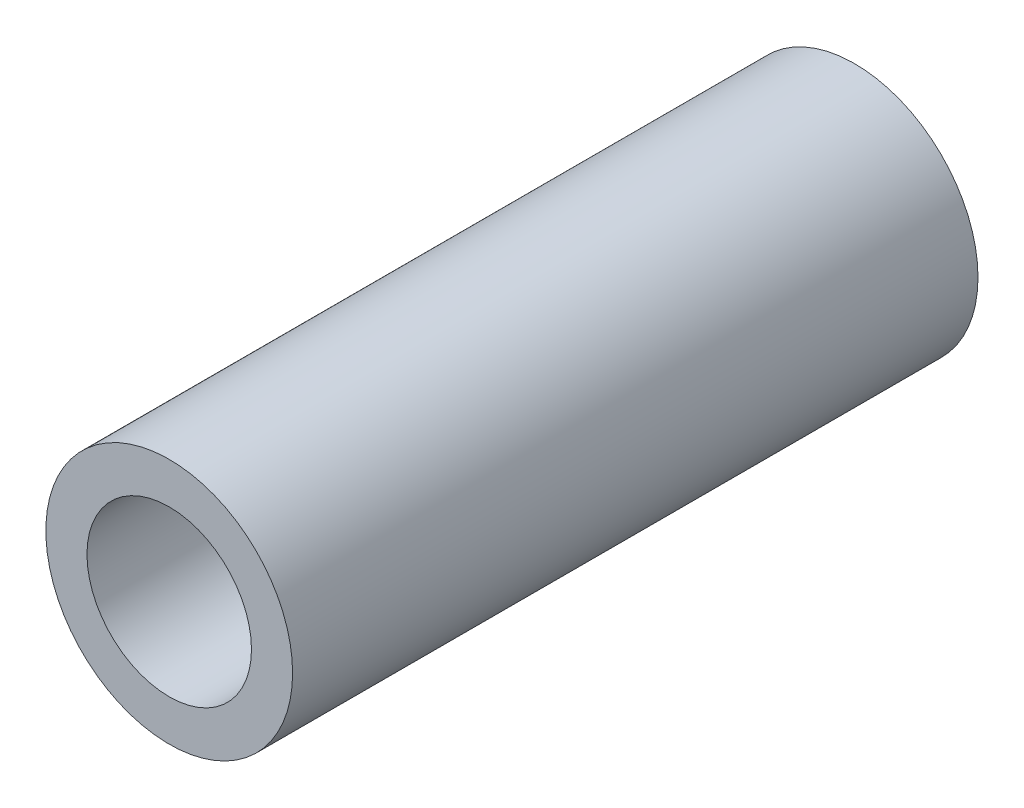
ISO-10303-21;
HEADER;
FILE_DESCRIPTION(('STEP AP214'),'2;1');
FILE_NAME('part.step','',(''),(''),'','','');
FILE_SCHEMA(('AUTOMOTIVE_DESIGN { 1 0 10303 214 1 1 1 1 }'));
ENDSEC;
DATA;
#1=APPLICATION_CONTEXT('core data for automotive mechanical design processes');
#2=APPLICATION_PROTOCOL_DEFINITION('international standard','automotive_design',2000,#1);
#3=PRODUCT_CONTEXT('',#1,'mechanical');
#4=PRODUCT('Part','Part','',(#3));
#5=PRODUCT_RELATED_PRODUCT_CATEGORY('part','',(#4));
#6=PRODUCT_DEFINITION_FORMATION('','',#4);
#7=PRODUCT_DEFINITION_CONTEXT('part definition',#1,'design');
#8=PRODUCT_DEFINITION('design','',#6,#7);
#9=PRODUCT_DEFINITION_SHAPE('','',#8);
#10=(LENGTH_UNIT() NAMED_UNIT(*) SI_UNIT(.MILLI.,.METRE.));
#11=(NAMED_UNIT(*) PLANE_ANGLE_UNIT() SI_UNIT($,.RADIAN.));
#12=(NAMED_UNIT(*) SI_UNIT($,.STERADIAN.) SOLID_ANGLE_UNIT());
#13=UNCERTAINTY_MEASURE_WITH_UNIT(LENGTH_MEASURE(1.E-05),#10,'distance_accuracy_value','');
#14=(GEOMETRIC_REPRESENTATION_CONTEXT(3) GLOBAL_UNCERTAINTY_ASSIGNED_CONTEXT((#13)) GLOBAL_UNIT_ASSIGNED_CONTEXT((#10,
#11,#12)) REPRESENTATION_CONTEXT('',''));
#15=CARTESIAN_POINT('',(0.,0.,0.));
#16=DIRECTION('',(0.,0.,1.));
#17=DIRECTION('',(1.,0.,0.));
#18=AXIS2_PLACEMENT_3D('',#15,#16,#17);
#19=CARTESIAN_POINT('',(0.,0.,50.));
#20=DIRECTION('',(0.,0.,1.));
#21=DIRECTION('',(1.,0.,0.));
#22=AXIS2_PLACEMENT_3D('',#19,#20,#21);
#23=PLANE('',#22);
#24=CARTESIAN_POINT('',(0.,0.,50.));
#25=DIRECTION('',(0.,0.,1.));
#26=DIRECTION('',(1.,0.,0.));
#27=AXIS2_PLACEMENT_3D('',#24,#25,#26);
#28=CIRCLE('',#27,9.);
#29=CARTESIAN_POINT('',(9.,0.,50.));
#30=VERTEX_POINT('',#29);
#31=EDGE_CURVE('E10',#30,#30,#28,.T.);
#32=ORIENTED_EDGE('',*,*,#31,.T.);
#33=EDGE_LOOP('',(#32));
#34=FACE_BOUND('',#33,.T.);
#35=CARTESIAN_POINT('',(0.,0.,50.));
#36=DIRECTION('',(0.,0.,1.));
#37=DIRECTION('',(1.,0.,0.));
#38=AXIS2_PLACEMENT_3D('',#35,#36,#37);
#39=CIRCLE('',#38,6.);
#40=CARTESIAN_POINT('',(6.,0.,50.));
#41=VERTEX_POINT('',#40);
#42=EDGE_CURVE('E45',#41,#41,#39,.T.);
#43=ORIENTED_EDGE('',*,*,#42,.F.);
#44=EDGE_LOOP('',(#43));
#45=FACE_BOUND('',#44,.T.);
#46=ADVANCED_FACE('F34',(#34,#45),#23,.T.);
#47=CARTESIAN_POINT('',(0.,0.,0.));
#48=DIRECTION('',(0.,0.,1.));
#49=DIRECTION('',(1.,0.,0.));
#50=AXIS2_PLACEMENT_3D('',#47,#48,#49);
#51=PLANE('',#50);
#52=CARTESIAN_POINT('',(0.,0.,0.));
#53=DIRECTION('',(0.,0.,1.));
#54=DIRECTION('',(1.,0.,0.));
#55=AXIS2_PLACEMENT_3D('',#52,#53,#54);
#56=CIRCLE('',#55,9.);
#57=CARTESIAN_POINT('',(9.,0.,0.));
#58=VERTEX_POINT('',#57);
#59=EDGE_CURVE('E38',#58,#58,#56,.T.);
#60=ORIENTED_EDGE('',*,*,#59,.F.);
#61=EDGE_LOOP('',(#60));
#62=FACE_BOUND('',#61,.T.);
#63=CARTESIAN_POINT('',(0.,0.,0.));
#64=DIRECTION('',(0.,0.,1.));
#65=DIRECTION('',(1.,0.,0.));
#66=AXIS2_PLACEMENT_3D('',#63,#64,#65);
#67=CIRCLE('',#66,6.);
#68=CARTESIAN_POINT('',(6.,0.,0.));
#69=VERTEX_POINT('',#68);
#70=EDGE_CURVE('E47',#69,#69,#67,.T.);
#71=ORIENTED_EDGE('',*,*,#70,.T.);
#72=EDGE_LOOP('',(#71));
#73=FACE_BOUND('',#72,.T.);
#74=ADVANCED_FACE('F57',(#62,#73),#51,.F.);
#75=CARTESIAN_POINT('',(0.,0.,50.));
#76=DIRECTION('',(0.,0.,-1.));
#77=DIRECTION('',(-1.,0.,0.));
#78=AXIS2_PLACEMENT_3D('',#75,#76,#77);
#79=CYLINDRICAL_SURFACE('',#78,9.);
#80=ORIENTED_EDGE('',*,*,#31,.F.);
#81=EDGE_LOOP('',(#80));
#82=FACE_BOUND('',#81,.T.);
#83=ORIENTED_EDGE('',*,*,#59,.T.);
#84=EDGE_LOOP('',(#83));
#85=FACE_BOUND('',#84,.T.);
#86=ADVANCED_FACE('F36',(#82,#85),#79,.T.);
#87=CARTESIAN_POINT('',(0.,0.,50.));
#88=DIRECTION('',(0.,0.,-1.));
#89=DIRECTION('',(-1.,0.,0.));
#90=AXIS2_PLACEMENT_3D('',#87,#88,#89);
#91=CYLINDRICAL_SURFACE('',#90,6.);
#92=ORIENTED_EDGE('',*,*,#42,.T.);
#93=EDGE_LOOP('',(#92));
#94=FACE_BOUND('',#93,.T.);
#95=ORIENTED_EDGE('',*,*,#70,.F.);
#96=EDGE_LOOP('',(#95));
#97=FACE_BOUND('',#96,.T.);
#98=ADVANCED_FACE('F53',(#94,#97),#91,.F.);
#99=CLOSED_SHELL('',(#46,#74,#86,#98));
#100=MANIFOLD_SOLID_BREP('B2',#99);
#101=ADVANCED_BREP_SHAPE_REPRESENTATION('',(#18,#100),#14);
#102=SHAPE_DEFINITION_REPRESENTATION(#9,#101);
ENDSEC;
END-ISO-10303-21;
